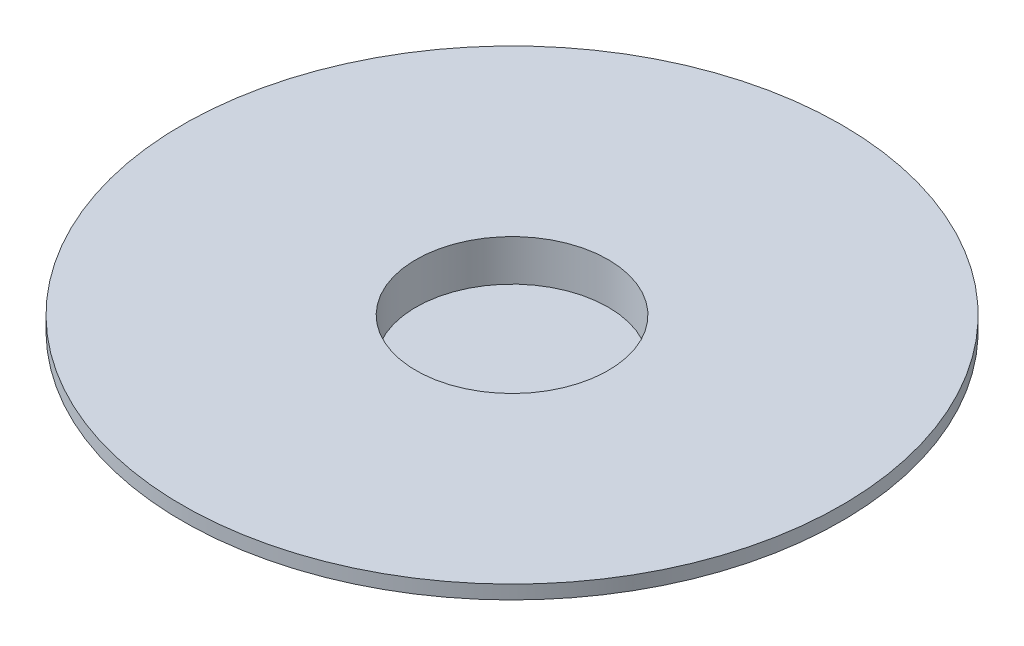
ISO-10303-21;
HEADER;
FILE_DESCRIPTION(('STEP AP214'),'2;1');
FILE_NAME('part.step','',(''),(''),'','','');
FILE_SCHEMA(('AUTOMOTIVE_DESIGN { 1 0 10303 214 1 1 1 1 }'));
ENDSEC;
DATA;
#1=APPLICATION_CONTEXT('core data for automotive mechanical design processes');
#2=APPLICATION_PROTOCOL_DEFINITION('international standard','automotive_design',2000,#1);
#3=PRODUCT_CONTEXT('',#1,'mechanical');
#4=PRODUCT('Part','Part','',(#3));
#5=PRODUCT_RELATED_PRODUCT_CATEGORY('part','',(#4));
#6=PRODUCT_DEFINITION_FORMATION('','',#4);
#7=PRODUCT_DEFINITION_CONTEXT('part definition',#1,'design');
#8=PRODUCT_DEFINITION('design','',#6,#7);
#9=PRODUCT_DEFINITION_SHAPE('','',#8);
#10=(LENGTH_UNIT() NAMED_UNIT(*) SI_UNIT(.MILLI.,.METRE.));
#11=(NAMED_UNIT(*) PLANE_ANGLE_UNIT() SI_UNIT($,.RADIAN.));
#12=(NAMED_UNIT(*) SI_UNIT($,.STERADIAN.) SOLID_ANGLE_UNIT());
#13=UNCERTAINTY_MEASURE_WITH_UNIT(LENGTH_MEASURE(1.E-05),#10,'distance_accuracy_value','');
#14=(GEOMETRIC_REPRESENTATION_CONTEXT(3) GLOBAL_UNCERTAINTY_ASSIGNED_CONTEXT((#13)) GLOBAL_UNIT_ASSIGNED_CONTEXT((#10,
#11,#12)) REPRESENTATION_CONTEXT('',''));
#15=CARTESIAN_POINT('',(0.,0.,0.));
#16=DIRECTION('',(0.,0.,1.));
#17=DIRECTION('',(1.,0.,0.));
#18=AXIS2_PLACEMENT_3D('',#15,#16,#17);
#19=CARTESIAN_POINT('',(0.,0.,0.));
#20=DIRECTION('',(0.,-1.,0.));
#21=DIRECTION('',(0.,0.,-1.));
#22=AXIS2_PLACEMENT_3D('',#19,#20,#21);
#23=PLANE('',#22);
#24=CARTESIAN_POINT('',(0.,0.,0.));
#25=DIRECTION('',(0.,-1.,0.));
#26=DIRECTION('',(0.,0.,-1.));
#27=AXIS2_PLACEMENT_3D('',#24,#25,#26);
#28=CIRCLE('',#27,35.);
#29=CARTESIAN_POINT('',(0.,0.,-35.));
#30=VERTEX_POINT('',#29);
#31=EDGE_CURVE('E10',#30,#30,#28,.T.);
#32=ORIENTED_EDGE('',*,*,#31,.F.);
#33=EDGE_LOOP('',(#32));
#34=FACE_BOUND('',#33,.T.);
#35=ADVANCED_FACE('F37',(#34),#23,.F.);
#36=CARTESIAN_POINT('',(0.,-30.,0.));
#37=DIRECTION('',(0.,-1.,0.));
#38=DIRECTION('',(0.,0.,-1.));
#39=AXIS2_PLACEMENT_3D('',#36,#37,#38);
#40=CYLINDRICAL_SURFACE('',#39,35.);
#41=CARTESIAN_POINT('',(0.,15.,0.));
#42=DIRECTION('',(0.,-1.,0.));
#43=DIRECTION('',(0.,0.,-1.));
#44=AXIS2_PLACEMENT_3D('',#41,#42,#43);
#45=CIRCLE('',#44,35.);
#46=CARTESIAN_POINT('',(0.,15.,-35.));
#47=VERTEX_POINT('',#46);
#48=EDGE_CURVE('E44',#47,#47,#45,.T.);
#49=ORIENTED_EDGE('',*,*,#48,.F.);
#50=EDGE_LOOP('',(#49));
#51=FACE_BOUND('',#50,.T.);
#52=ORIENTED_EDGE('',*,*,#31,.T.);
#53=EDGE_LOOP('',(#52));
#54=FACE_BOUND('',#53,.T.);
#55=ADVANCED_FACE('F111',(#51,#54),#40,.F.);
#56=CARTESIAN_POINT('',(-120.,15.,0.));
#57=DIRECTION('',(0.,-1.,0.));
#58=DIRECTION('',(0.,0.,-1.));
#59=AXIS2_PLACEMENT_3D('',#56,#57,#58);
#60=PLANE('',#59);
#61=CARTESIAN_POINT('',(0.,15.,0.));
#62=DIRECTION('',(0.,-1.,0.));
#63=DIRECTION('',(0.,0.,-1.));
#64=AXIS2_PLACEMENT_3D('',#61,#62,#63);
#65=CIRCLE('',#64,120.);
#66=CARTESIAN_POINT('',(0.,15.,-120.));
#67=VERTEX_POINT('',#66);
#68=EDGE_CURVE('E49',#67,#67,#65,.T.);
#69=ORIENTED_EDGE('',*,*,#68,.F.);
#70=EDGE_LOOP('',(#69));
#71=FACE_BOUND('',#70,.T.);
#72=ORIENTED_EDGE('',*,*,#48,.T.);
#73=EDGE_LOOP('',(#72));
#74=FACE_BOUND('',#73,.T.);
#75=ADVANCED_FACE('F106',(#71,#74),#60,.F.);
#76=CARTESIAN_POINT('',(0.,-30.,0.));
#77=DIRECTION('',(0.,-1.,0.));
#78=DIRECTION('',(0.,0.,-1.));
#79=AXIS2_PLACEMENT_3D('',#76,#77,#78);
#80=CYLINDRICAL_SURFACE('',#79,120.);
#81=CARTESIAN_POINT('',(0.,9.99999999999998,0.));
#82=DIRECTION('',(0.,-1.,0.));
#83=DIRECTION('',(0.,0.,-1.));
#84=AXIS2_PLACEMENT_3D('',#81,#82,#83);
#85=CIRCLE('',#84,120.);
#86=CARTESIAN_POINT('',(0.,9.99999999999998,-120.));
#87=VERTEX_POINT('',#86);
#88=EDGE_CURVE('E54',#87,#87,#85,.T.);
#89=ORIENTED_EDGE('',*,*,#88,.F.);
#90=EDGE_LOOP('',(#89));
#91=FACE_BOUND('',#90,.T.);
#92=ORIENTED_EDGE('',*,*,#68,.T.);
#93=EDGE_LOOP('',(#92));
#94=FACE_BOUND('',#93,.T.);
#95=ADVANCED_FACE('F100',(#91,#94),#80,.T.);
#96=CARTESIAN_POINT('',(-40.,9.99999999999999,0.));
#97=DIRECTION('',(0.,1.,0.));
#98=DIRECTION('',(0.,0.,1.));
#99=AXIS2_PLACEMENT_3D('',#96,#97,#98);
#100=PLANE('',#99);
#101=CARTESIAN_POINT('',(0.,9.99999999999999,0.));
#102=DIRECTION('',(0.,-1.,0.));
#103=DIRECTION('',(0.,0.,-1.));
#104=AXIS2_PLACEMENT_3D('',#101,#102,#103);
#105=CIRCLE('',#104,40.);
#106=CARTESIAN_POINT('',(0.,9.99999999999999,-40.));
#107=VERTEX_POINT('',#106);
#108=EDGE_CURVE('E60',#107,#107,#105,.T.);
#109=ORIENTED_EDGE('',*,*,#108,.F.);
#110=EDGE_LOOP('',(#109));
#111=FACE_BOUND('',#110,.T.);
#112=ORIENTED_EDGE('',*,*,#88,.T.);
#113=EDGE_LOOP('',(#112));
#114=FACE_BOUND('',#113,.T.);
#115=ADVANCED_FACE('F94',(#111,#114),#100,.F.);
#116=CARTESIAN_POINT('',(0.,-30.,0.));
#117=DIRECTION('',(0.,-1.,0.));
#118=DIRECTION('',(0.,0.,-1.));
#119=AXIS2_PLACEMENT_3D('',#116,#117,#118);
#120=CYLINDRICAL_SURFACE('',#119,40.);
#121=CARTESIAN_POINT('',(0.,-30.,0.));
#122=DIRECTION('',(0.,-1.,0.));
#123=DIRECTION('',(0.,0.,-1.));
#124=AXIS2_PLACEMENT_3D('',#121,#122,#123);
#125=CIRCLE('',#124,40.);
#126=CARTESIAN_POINT('',(0.,-30.,-40.));
#127=VERTEX_POINT('',#126);
#128=EDGE_CURVE('E64',#127,#127,#125,.T.);
#129=ORIENTED_EDGE('',*,*,#128,.F.);
#130=EDGE_LOOP('',(#129));
#131=FACE_BOUND('',#130,.T.);
#132=ORIENTED_EDGE('',*,*,#108,.T.);
#133=EDGE_LOOP('',(#132));
#134=FACE_BOUND('',#133,.T.);
#135=ADVANCED_FACE('F88',(#131,#134),#120,.T.);
#136=CARTESIAN_POINT('',(-40.,-30.,0.));
#137=DIRECTION('',(0.,1.,0.));
#138=DIRECTION('',(0.,0.,1.));
#139=AXIS2_PLACEMENT_3D('',#136,#137,#138);
#140=PLANE('',#139);
#141=CARTESIAN_POINT('',(0.,-30.,0.));
#142=DIRECTION('',(0.,-1.,0.));
#143=DIRECTION('',(0.,0.,-1.));
#144=AXIS2_PLACEMENT_3D('',#141,#142,#143);
#145=CIRCLE('',#144,35.);
#146=CARTESIAN_POINT('',(0.,-30.,-35.));
#147=VERTEX_POINT('',#146);
#148=EDGE_CURVE('E69',#147,#147,#145,.T.);
#149=ORIENTED_EDGE('',*,*,#148,.F.);
#150=EDGE_LOOP('',(#149));
#151=FACE_BOUND('',#150,.T.);
#152=ORIENTED_EDGE('',*,*,#128,.T.);
#153=EDGE_LOOP('',(#152));
#154=FACE_BOUND('',#153,.T.);
#155=ADVANCED_FACE('F82',(#151,#154),#140,.F.);
#156=CARTESIAN_POINT('',(0.,-10.,0.));
#157=DIRECTION('',(0.,-1.,0.));
#158=DIRECTION('',(0.,0.,-1.));
#159=AXIS2_PLACEMENT_3D('',#156,#157,#158);
#160=CYLINDRICAL_SURFACE('',#159,35.);
#161=CARTESIAN_POINT('',(0.,-10.,0.));
#162=DIRECTION('',(0.,-1.,0.));
#163=DIRECTION('',(0.,0.,-1.));
#164=AXIS2_PLACEMENT_3D('',#161,#162,#163);
#165=CIRCLE('',#164,35.);
#166=CARTESIAN_POINT('',(0.,-10.,-35.));
#167=VERTEX_POINT('',#166);
#168=EDGE_CURVE('E68',#167,#167,#165,.T.);
#169=ORIENTED_EDGE('',*,*,#168,.F.);
#170=EDGE_LOOP('',(#169));
#171=FACE_BOUND('',#170,.T.);
#172=ORIENTED_EDGE('',*,*,#148,.T.);
#173=EDGE_LOOP('',(#172));
#174=FACE_BOUND('',#173,.T.);
#175=ADVANCED_FACE('F79',(#171,#174),#160,.F.);
#176=CARTESIAN_POINT('',(0.,-10.,0.));
#177=DIRECTION('',(0.,-1.,0.));
#178=DIRECTION('',(0.,0.,-1.));
#179=AXIS2_PLACEMENT_3D('',#176,#177,#178);
#180=PLANE('',#179);
#181=ORIENTED_EDGE('',*,*,#168,.T.);
#182=EDGE_LOOP('',(#181));
#183=FACE_BOUND('',#182,.T.);
#184=ADVANCED_FACE('F77',(#183),#180,.T.);
#185=CLOSED_SHELL('',(#35,#55,#75,#95,#115,#135,#155,#175,#184));
#186=MANIFOLD_SOLID_BREP('B2',#185);
#187=ADVANCED_BREP_SHAPE_REPRESENTATION('',(#18,#186),#14);
#188=SHAPE_DEFINITION_REPRESENTATION(#9,#187);
ENDSEC;
END-ISO-10303-21;
